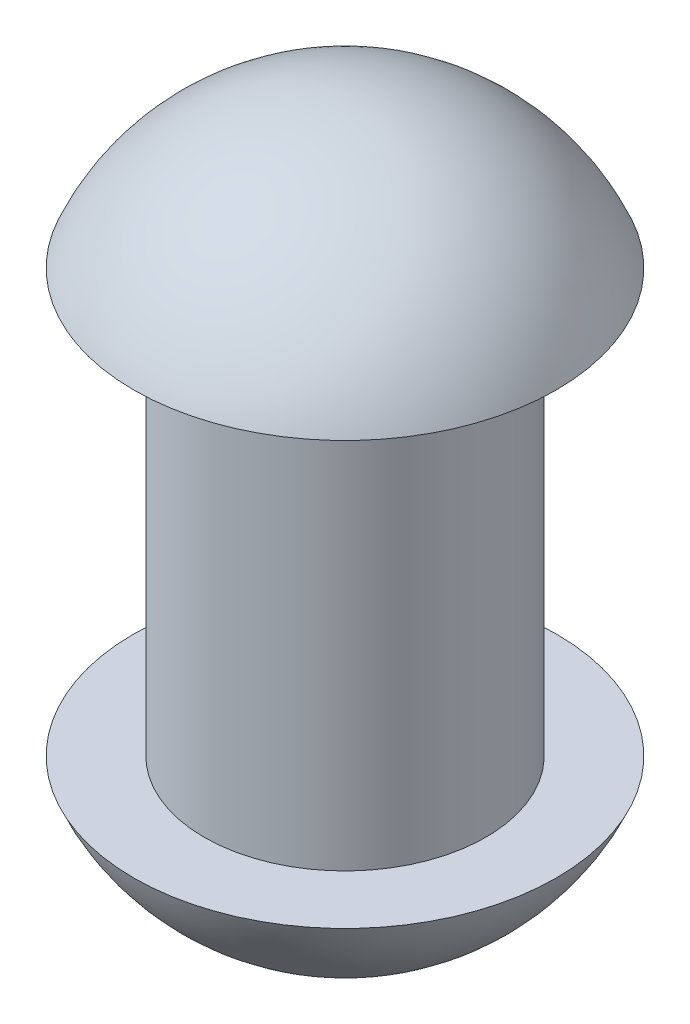
ISO-10303-21;
HEADER;
FILE_DESCRIPTION(('STEP AP214'),'2;1');
FILE_NAME('part.step','',(''),(''),'','','');
FILE_SCHEMA(('AUTOMOTIVE_DESIGN { 1 0 10303 214 1 1 1 1 }'));
ENDSEC;
DATA;
#1=APPLICATION_CONTEXT('core data for automotive mechanical design processes');
#2=APPLICATION_PROTOCOL_DEFINITION('international standard','automotive_design',2000,#1);
#3=PRODUCT_CONTEXT('',#1,'mechanical');
#4=PRODUCT('Part','Part','',(#3));
#5=PRODUCT_RELATED_PRODUCT_CATEGORY('part','',(#4));
#6=PRODUCT_DEFINITION_FORMATION('','',#4);
#7=PRODUCT_DEFINITION_CONTEXT('part definition',#1,'design');
#8=PRODUCT_DEFINITION('design','',#6,#7);
#9=PRODUCT_DEFINITION_SHAPE('','',#8);
#10=(LENGTH_UNIT() NAMED_UNIT(*) SI_UNIT(.MILLI.,.METRE.));
#11=(NAMED_UNIT(*) PLANE_ANGLE_UNIT() SI_UNIT($,.RADIAN.));
#12=(NAMED_UNIT(*) SI_UNIT($,.STERADIAN.) SOLID_ANGLE_UNIT());
#13=UNCERTAINTY_MEASURE_WITH_UNIT(LENGTH_MEASURE(1.E-05),#10,'distance_accuracy_value','');
#14=(GEOMETRIC_REPRESENTATION_CONTEXT(3) GLOBAL_UNCERTAINTY_ASSIGNED_CONTEXT((#13)) GLOBAL_UNIT_ASSIGNED_CONTEXT((#10,
#11,#12)) REPRESENTATION_CONTEXT('',''));
#15=CARTESIAN_POINT('',(0.,0.,0.));
#16=DIRECTION('',(0.,0.,1.));
#17=DIRECTION('',(1.,0.,0.));
#18=AXIS2_PLACEMENT_3D('',#15,#16,#17);
#19=CARTESIAN_POINT('',(0.,1.625,0.));
#20=DIRECTION('',(0.,-1.,0.));
#21=DIRECTION('',(-1.,0.,0.));
#22=AXIS2_PLACEMENT_3D('',#19,#20,#21);
#23=SPHERICAL_SURFACE('',#22,1.625);
#24=CARTESIAN_POINT('',(0.,1.,0.));
#25=DIRECTION('',(0.,-1.,0.));
#26=DIRECTION('',(0.,0.,-1.));
#27=AXIS2_PLACEMENT_3D('',#24,#25,#26);
#28=CIRCLE('',#27,1.5);
#29=CARTESIAN_POINT('',(0.,1.,-1.5));
#30=VERTEX_POINT('',#29);
#31=EDGE_CURVE('E10',#30,#30,#28,.T.);
#32=ORIENTED_EDGE('',*,*,#31,.T.);
#33=EDGE_LOOP('',(#32));
#34=FACE_BOUND('',#33,.T.);
#35=ADVANCED_FACE('F34',(#34),#23,.T.);
#36=CARTESIAN_POINT('',(1.5,1.,0.));
#37=DIRECTION('',(0.,1.,0.));
#38=DIRECTION('',(0.,0.,1.));
#39=AXIS2_PLACEMENT_3D('',#36,#37,#38);
#40=PLANE('',#39);
#41=CARTESIAN_POINT('',(0.,1.,0.));
#42=DIRECTION('',(0.,-1.,0.));
#43=DIRECTION('',(0.,0.,-1.));
#44=AXIS2_PLACEMENT_3D('',#41,#42,#43);
#45=CIRCLE('',#44,1.);
#46=CARTESIAN_POINT('',(0.,1.,-1.));
#47=VERTEX_POINT('',#46);
#48=EDGE_CURVE('E40',#47,#47,#45,.T.);
#49=ORIENTED_EDGE('',*,*,#48,.T.);
#50=EDGE_LOOP('',(#49));
#51=FACE_BOUND('',#50,.T.);
#52=ORIENTED_EDGE('',*,*,#31,.F.);
#53=EDGE_LOOP('',(#52));
#54=FACE_BOUND('',#53,.T.);
#55=ADVANCED_FACE('F66',(#51,#54),#40,.T.);
#56=CARTESIAN_POINT('',(0.,0.,0.));
#57=DIRECTION('',(0.,-1.,0.));
#58=DIRECTION('',(0.,0.,-1.));
#59=AXIS2_PLACEMENT_3D('',#56,#57,#58);
#60=CYLINDRICAL_SURFACE('',#59,1.);
#61=CARTESIAN_POINT('',(0.,4.,0.));
#62=DIRECTION('',(0.,-1.,0.));
#63=DIRECTION('',(0.,0.,-1.));
#64=AXIS2_PLACEMENT_3D('',#61,#62,#63);
#65=CIRCLE('',#64,1.);
#66=CARTESIAN_POINT('',(0.,4.,-1.));
#67=VERTEX_POINT('',#66);
#68=EDGE_CURVE('E44',#67,#67,#65,.T.);
#69=ORIENTED_EDGE('',*,*,#68,.T.);
#70=EDGE_LOOP('',(#69));
#71=FACE_BOUND('',#70,.T.);
#72=ORIENTED_EDGE('',*,*,#48,.F.);
#73=EDGE_LOOP('',(#72));
#74=FACE_BOUND('',#73,.T.);
#75=ADVANCED_FACE('F63',(#71,#74),#60,.T.);
#76=CARTESIAN_POINT('',(1.5,4.,0.));
#77=DIRECTION('',(0.,-1.,0.));
#78=DIRECTION('',(0.,0.,-1.));
#79=AXIS2_PLACEMENT_3D('',#76,#77,#78);
#80=PLANE('',#79);
#81=CARTESIAN_POINT('',(0.,4.,0.));
#82=DIRECTION('',(0.,-1.,0.));
#83=DIRECTION('',(0.,0.,-1.));
#84=AXIS2_PLACEMENT_3D('',#81,#82,#83);
#85=CIRCLE('',#84,1.5);
#86=CARTESIAN_POINT('',(0.,4.,-1.5));
#87=VERTEX_POINT('',#86);
#88=EDGE_CURVE('E48',#87,#87,#85,.T.);
#89=ORIENTED_EDGE('',*,*,#88,.T.);
#90=EDGE_LOOP('',(#89));
#91=FACE_BOUND('',#90,.T.);
#92=ORIENTED_EDGE('',*,*,#68,.F.);
#93=EDGE_LOOP('',(#92));
#94=FACE_BOUND('',#93,.T.);
#95=ADVANCED_FACE('F54',(#91,#94),#80,.T.);
#96=CARTESIAN_POINT('',(0.,3.375,0.));
#97=DIRECTION('',(0.,-1.,0.));
#98=DIRECTION('',(1.,0.,0.));
#99=AXIS2_PLACEMENT_3D('',#96,#97,#98);
#100=SPHERICAL_SURFACE('',#99,1.625);
#101=ORIENTED_EDGE('',*,*,#88,.F.);
#102=EDGE_LOOP('',(#101));
#103=FACE_BOUND('',#102,.T.);
#104=ADVANCED_FACE('F57',(#103),#100,.T.);
#105=CLOSED_SHELL('',(#35,#55,#75,#95,#104));
#106=MANIFOLD_SOLID_BREP('B2',#105);
#107=ADVANCED_BREP_SHAPE_REPRESENTATION('',(#18,#106),#14);
#108=SHAPE_DEFINITION_REPRESENTATION(#9,#107);
ENDSEC;
END-ISO-10303-21;
